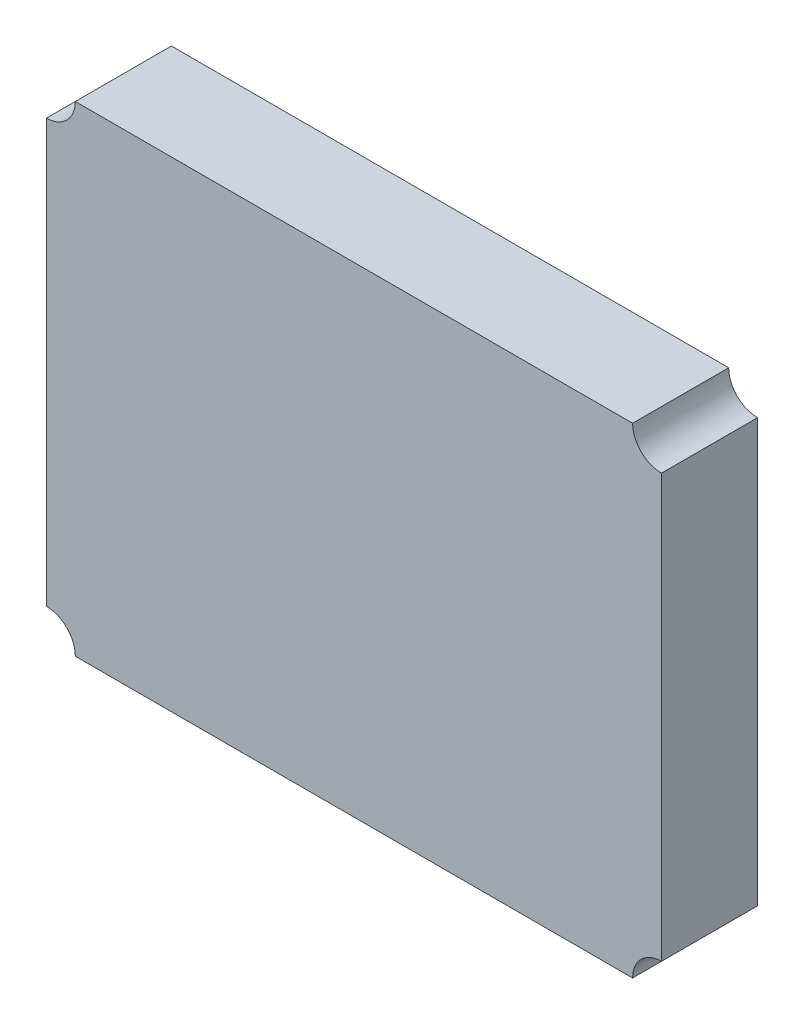
ISO-10303-21;
HEADER;
FILE_DESCRIPTION(('STEP AP214'),'2;1');
FILE_NAME('part.step','',(''),(''),'','','');
FILE_SCHEMA(('AUTOMOTIVE_DESIGN { 1 0 10303 214 1 1 1 1 }'));
ENDSEC;
DATA;
#1=APPLICATION_CONTEXT('core data for automotive mechanical design processes');
#2=APPLICATION_PROTOCOL_DEFINITION('international standard','automotive_design',2000,#1);
#3=PRODUCT_CONTEXT('',#1,'mechanical');
#4=PRODUCT('Part','Part','',(#3));
#5=PRODUCT_RELATED_PRODUCT_CATEGORY('part','',(#4));
#6=PRODUCT_DEFINITION_FORMATION('','',#4);
#7=PRODUCT_DEFINITION_CONTEXT('part definition',#1,'design');
#8=PRODUCT_DEFINITION('design','',#6,#7);
#9=PRODUCT_DEFINITION_SHAPE('','',#8);
#10=(LENGTH_UNIT() NAMED_UNIT(*) SI_UNIT(.MILLI.,.METRE.));
#11=(NAMED_UNIT(*) PLANE_ANGLE_UNIT() SI_UNIT($,.RADIAN.));
#12=(NAMED_UNIT(*) SI_UNIT($,.STERADIAN.) SOLID_ANGLE_UNIT());
#13=UNCERTAINTY_MEASURE_WITH_UNIT(LENGTH_MEASURE(1.E-05),#10,'distance_accuracy_value','');
#14=(GEOMETRIC_REPRESENTATION_CONTEXT(3) GLOBAL_UNCERTAINTY_ASSIGNED_CONTEXT((#13)) GLOBAL_UNIT_ASSIGNED_CONTEXT((#10,
#11,#12)) REPRESENTATION_CONTEXT('',''));
#15=CARTESIAN_POINT('',(0.,0.,0.));
#16=DIRECTION('',(0.,0.,1.));
#17=DIRECTION('',(1.,0.,0.));
#18=AXIS2_PLACEMENT_3D('',#15,#16,#17);
#19=CARTESIAN_POINT('',(0.,0.,0.5));
#20=DIRECTION('',(0.,0.,1.));
#21=DIRECTION('',(1.,0.,0.));
#22=AXIS2_PLACEMENT_3D('',#19,#20,#21);
#23=PLANE('',#22);
#24=CARTESIAN_POINT('',(-1.6,1.25,0.5));
#25=DIRECTION('',(0.,0.,1.));
#26=DIRECTION('',(1.,0.,0.));
#27=AXIS2_PLACEMENT_3D('',#24,#25,#26);
#28=CIRCLE('',#27,0.15);
#29=CARTESIAN_POINT('',(-1.6,1.1,0.5));
#30=VERTEX_POINT('',#29);
#31=CARTESIAN_POINT('',(-1.45,1.25,0.5));
#32=VERTEX_POINT('',#31);
#33=EDGE_CURVE('E137',#30,#32,#28,.T.);
#34=ORIENTED_EDGE('',*,*,#33,.F.);
#35=DIRECTION('',(0.,-1.,0.));
#36=VECTOR('',#35,1.);
#37=CARTESIAN_POINT('',(-1.6,1.1,0.5));
#38=LINE('',#37,#36);
#39=CARTESIAN_POINT('',(-1.6,-1.1,0.5));
#40=VERTEX_POINT('',#39);
#41=EDGE_CURVE('E144',#30,#40,#38,.T.);
#42=ORIENTED_EDGE('',*,*,#41,.T.);
#43=CARTESIAN_POINT('',(-1.6,-1.25,0.5));
#44=DIRECTION('',(0.,0.,1.));
#45=DIRECTION('',(1.,0.,0.));
#46=AXIS2_PLACEMENT_3D('',#43,#44,#45);
#47=CIRCLE('',#46,0.15);
#48=CARTESIAN_POINT('',(-1.45,-1.25,0.5));
#49=VERTEX_POINT('',#48);
#50=EDGE_CURVE('E131',#49,#40,#47,.T.);
#51=ORIENTED_EDGE('',*,*,#50,.F.);
#52=DIRECTION('',(1.,0.,0.));
#53=VECTOR('',#52,1.);
#54=CARTESIAN_POINT('',(-1.45,-1.25,0.5));
#55=LINE('',#54,#53);
#56=CARTESIAN_POINT('',(1.45,-1.25,0.5));
#57=VERTEX_POINT('',#56);
#58=EDGE_CURVE('E118',#49,#57,#55,.T.);
#59=ORIENTED_EDGE('',*,*,#58,.T.);
#60=CARTESIAN_POINT('',(1.6,-1.25,0.5));
#61=DIRECTION('',(0.,0.,1.));
#62=DIRECTION('',(1.,0.,0.));
#63=AXIS2_PLACEMENT_3D('',#60,#61,#62);
#64=CIRCLE('',#63,0.15);
#65=CARTESIAN_POINT('',(1.6,-1.1,0.5));
#66=VERTEX_POINT('',#65);
#67=EDGE_CURVE('E109',#66,#57,#64,.T.);
#68=ORIENTED_EDGE('',*,*,#67,.F.);
#69=DIRECTION('',(0.,1.,0.));
#70=VECTOR('',#69,1.);
#71=CARTESIAN_POINT('',(1.6,-1.1,0.5));
#72=LINE('',#71,#70);
#73=CARTESIAN_POINT('',(1.6,1.1,0.5));
#74=VERTEX_POINT('',#73);
#75=EDGE_CURVE('E172',#66,#74,#72,.T.);
#76=ORIENTED_EDGE('',*,*,#75,.T.);
#77=CARTESIAN_POINT('',(1.6,1.25,0.5));
#78=DIRECTION('',(0.,0.,1.));
#79=DIRECTION('',(1.,0.,0.));
#80=AXIS2_PLACEMENT_3D('',#77,#78,#79);
#81=CIRCLE('',#80,0.15);
#82=CARTESIAN_POINT('',(1.45,1.25,0.5));
#83=VERTEX_POINT('',#82);
#84=EDGE_CURVE('E177',#83,#74,#81,.T.);
#85=ORIENTED_EDGE('',*,*,#84,.F.);
#86=DIRECTION('',(1.,0.,0.));
#87=VECTOR('',#86,1.);
#88=CARTESIAN_POINT('',(-1.45,1.25,0.5));
#89=LINE('',#88,#87);
#90=EDGE_CURVE('E26',#32,#83,#89,.T.);
#91=ORIENTED_EDGE('',*,*,#90,.F.);
#92=EDGE_LOOP('',(#34,#42,#51,#59,#68,#76,#85,#91));
#93=FACE_BOUND('',#92,.T.);
#94=ADVANCED_FACE('F17',(#93),#23,.T.);
#95=CARTESIAN_POINT('',(0.,0.,0.));
#96=DIRECTION('',(0.,0.,1.));
#97=DIRECTION('',(1.,0.,0.));
#98=AXIS2_PLACEMENT_3D('',#95,#96,#97);
#99=PLANE('',#98);
#100=CARTESIAN_POINT('',(-1.6,1.25,0.));
#101=DIRECTION('',(0.,0.,1.));
#102=DIRECTION('',(1.,0.,0.));
#103=AXIS2_PLACEMENT_3D('',#100,#101,#102);
#104=CIRCLE('',#103,0.15);
#105=CARTESIAN_POINT('',(-1.6,1.1,0.));
#106=VERTEX_POINT('',#105);
#107=CARTESIAN_POINT('',(-1.45,1.25,0.));
#108=VERTEX_POINT('',#107);
#109=EDGE_CURVE('E143',#106,#108,#104,.T.);
#110=ORIENTED_EDGE('',*,*,#109,.T.);
#111=DIRECTION('',(1.,0.,0.));
#112=VECTOR('',#111,1.);
#113=CARTESIAN_POINT('',(-1.45,1.25,0.));
#114=LINE('',#113,#112);
#115=CARTESIAN_POINT('',(1.45,1.25,0.));
#116=VERTEX_POINT('',#115);
#117=EDGE_CURVE('E11',#108,#116,#114,.T.);
#118=ORIENTED_EDGE('',*,*,#117,.T.);
#119=CARTESIAN_POINT('',(1.6,1.25,0.));
#120=DIRECTION('',(0.,0.,1.));
#121=DIRECTION('',(1.,0.,0.));
#122=AXIS2_PLACEMENT_3D('',#119,#120,#121);
#123=CIRCLE('',#122,0.15);
#124=CARTESIAN_POINT('',(1.6,1.1,0.));
#125=VERTEX_POINT('',#124);
#126=EDGE_CURVE('E180',#116,#125,#123,.T.);
#127=ORIENTED_EDGE('',*,*,#126,.T.);
#128=DIRECTION('',(0.,1.,0.));
#129=VECTOR('',#128,1.);
#130=CARTESIAN_POINT('',(1.6,-1.1,0.));
#131=LINE('',#130,#129);
#132=CARTESIAN_POINT('',(1.6,-1.1,0.));
#133=VERTEX_POINT('',#132);
#134=EDGE_CURVE('E104',#133,#125,#131,.T.);
#135=ORIENTED_EDGE('',*,*,#134,.F.);
#136=CARTESIAN_POINT('',(1.6,-1.25,0.));
#137=DIRECTION('',(0.,0.,1.));
#138=DIRECTION('',(1.,0.,0.));
#139=AXIS2_PLACEMENT_3D('',#136,#137,#138);
#140=CIRCLE('',#139,0.15);
#141=CARTESIAN_POINT('',(1.45,-1.25,0.));
#142=VERTEX_POINT('',#141);
#143=EDGE_CURVE('E96',#133,#142,#140,.T.);
#144=ORIENTED_EDGE('',*,*,#143,.T.);
#145=DIRECTION('',(1.,0.,0.));
#146=VECTOR('',#145,1.);
#147=CARTESIAN_POINT('',(-1.45,-1.25,0.));
#148=LINE('',#147,#146);
#149=CARTESIAN_POINT('',(-1.45,-1.25,0.));
#150=VERTEX_POINT('',#149);
#151=EDGE_CURVE('E101',#150,#142,#148,.T.);
#152=ORIENTED_EDGE('',*,*,#151,.F.);
#153=CARTESIAN_POINT('',(-1.6,-1.25,0.));
#154=DIRECTION('',(0.,0.,1.));
#155=DIRECTION('',(1.,0.,0.));
#156=AXIS2_PLACEMENT_3D('',#153,#154,#155);
#157=CIRCLE('',#156,0.15);
#158=CARTESIAN_POINT('',(-1.6,-1.1,0.));
#159=VERTEX_POINT('',#158);
#160=EDGE_CURVE('E125',#150,#159,#157,.T.);
#161=ORIENTED_EDGE('',*,*,#160,.T.);
#162=DIRECTION('',(0.,-1.,0.));
#163=VECTOR('',#162,1.);
#164=CARTESIAN_POINT('',(-1.6,1.1,0.));
#165=LINE('',#164,#163);
#166=EDGE_CURVE('E151',#106,#159,#165,.T.);
#167=ORIENTED_EDGE('',*,*,#166,.F.);
#168=EDGE_LOOP('',(#110,#118,#127,#135,#144,#152,#161,#167));
#169=FACE_BOUND('',#168,.T.);
#170=ADVANCED_FACE('F99',(#169),#99,.F.);
#171=CARTESIAN_POINT('',(-1.45,1.25,0.));
#172=DIRECTION('',(0.,1.,0.));
#173=DIRECTION('',(1.,0.,0.));
#174=AXIS2_PLACEMENT_3D('',#171,#172,#173);
#175=PLANE('',#174);
#176=DIRECTION('',(0.,0.,1.));
#177=VECTOR('',#176,1.);
#178=CARTESIAN_POINT('',(-1.45,1.25,0.));
#179=LINE('',#178,#177);
#180=EDGE_CURVE('E140',#108,#32,#179,.T.);
#181=ORIENTED_EDGE('',*,*,#180,.T.);
#182=ORIENTED_EDGE('',*,*,#90,.T.);
#183=DIRECTION('',(0.,0.,1.));
#184=VECTOR('',#183,1.);
#185=CARTESIAN_POINT('',(1.45,1.25,0.));
#186=LINE('',#185,#184);
#187=EDGE_CURVE('E176',#116,#83,#186,.T.);
#188=ORIENTED_EDGE('',*,*,#187,.F.);
#189=ORIENTED_EDGE('',*,*,#117,.F.);
#190=EDGE_LOOP('',(#181,#182,#188,#189));
#191=FACE_BOUND('',#190,.T.);
#192=ADVANCED_FACE('F248',(#191),#175,.T.);
#193=CARTESIAN_POINT('',(1.6,1.25,0.));
#194=DIRECTION('',(0.,0.,-1.));
#195=DIRECTION('',(1.,0.,0.));
#196=AXIS2_PLACEMENT_3D('',#193,#194,#195);
#197=CYLINDRICAL_SURFACE('',#196,0.15);
#198=ORIENTED_EDGE('',*,*,#187,.T.);
#199=ORIENTED_EDGE('',*,*,#84,.T.);
#200=DIRECTION('',(0.,0.,1.));
#201=VECTOR('',#200,1.);
#202=CARTESIAN_POINT('',(1.6,1.1,0.));
#203=LINE('',#202,#201);
#204=EDGE_CURVE('E157',#125,#74,#203,.T.);
#205=ORIENTED_EDGE('',*,*,#204,.F.);
#206=ORIENTED_EDGE('',*,*,#126,.F.);
#207=EDGE_LOOP('',(#198,#199,#205,#206));
#208=FACE_BOUND('',#207,.T.);
#209=ADVANCED_FACE('F239',(#208),#197,.F.);
#210=CARTESIAN_POINT('',(1.6,-1.1,0.));
#211=DIRECTION('',(-1.,0.,0.));
#212=DIRECTION('',(0.,0.,1.));
#213=AXIS2_PLACEMENT_3D('',#210,#211,#212);
#214=PLANE('',#213);
#215=DIRECTION('',(0.,0.,1.));
#216=VECTOR('',#215,1.);
#217=CARTESIAN_POINT('',(1.6,-1.1,0.));
#218=LINE('',#217,#216);
#219=EDGE_CURVE('E154',#133,#66,#218,.T.);
#220=ORIENTED_EDGE('',*,*,#219,.F.);
#221=ORIENTED_EDGE('',*,*,#134,.T.);
#222=ORIENTED_EDGE('',*,*,#204,.T.);
#223=ORIENTED_EDGE('',*,*,#75,.F.);
#224=EDGE_LOOP('',(#220,#221,#222,#223));
#225=FACE_BOUND('',#224,.T.);
#226=ADVANCED_FACE('F225',(#225),#214,.F.);
#227=CARTESIAN_POINT('',(1.6,-1.25,0.));
#228=DIRECTION('',(0.,0.,-1.));
#229=DIRECTION('',(1.,0.,0.));
#230=AXIS2_PLACEMENT_3D('',#227,#228,#229);
#231=CYLINDRICAL_SURFACE('',#230,0.15);
#232=ORIENTED_EDGE('',*,*,#219,.T.);
#233=ORIENTED_EDGE('',*,*,#67,.T.);
#234=DIRECTION('',(0.,0.,1.));
#235=VECTOR('',#234,1.);
#236=CARTESIAN_POINT('',(1.45,-1.25,0.));
#237=LINE('',#236,#235);
#238=EDGE_CURVE('E112',#142,#57,#237,.T.);
#239=ORIENTED_EDGE('',*,*,#238,.F.);
#240=ORIENTED_EDGE('',*,*,#143,.F.);
#241=EDGE_LOOP('',(#232,#233,#239,#240));
#242=FACE_BOUND('',#241,.T.);
#243=ADVANCED_FACE('F113',(#242),#231,.F.);
#244=CARTESIAN_POINT('',(-1.45,-1.25,0.));
#245=DIRECTION('',(0.,1.,0.));
#246=DIRECTION('',(1.,0.,0.));
#247=AXIS2_PLACEMENT_3D('',#244,#245,#246);
#248=PLANE('',#247);
#249=DIRECTION('',(0.,0.,1.));
#250=VECTOR('',#249,1.);
#251=CARTESIAN_POINT('',(-1.45,-1.25,0.));
#252=LINE('',#251,#250);
#253=EDGE_CURVE('E123',#150,#49,#252,.T.);
#254=ORIENTED_EDGE('',*,*,#253,.F.);
#255=ORIENTED_EDGE('',*,*,#151,.T.);
#256=ORIENTED_EDGE('',*,*,#238,.T.);
#257=ORIENTED_EDGE('',*,*,#58,.F.);
#258=EDGE_LOOP('',(#254,#255,#256,#257));
#259=FACE_BOUND('',#258,.T.);
#260=ADVANCED_FACE('F121',(#259),#248,.F.);
#261=CARTESIAN_POINT('',(-1.6,-1.25,0.));
#262=DIRECTION('',(0.,0.,-1.));
#263=DIRECTION('',(1.,0.,0.));
#264=AXIS2_PLACEMENT_3D('',#261,#262,#263);
#265=CYLINDRICAL_SURFACE('',#264,0.15);
#266=ORIENTED_EDGE('',*,*,#253,.T.);
#267=ORIENTED_EDGE('',*,*,#50,.T.);
#268=DIRECTION('',(0.,0.,1.));
#269=VECTOR('',#268,1.);
#270=CARTESIAN_POINT('',(-1.6,-1.1,0.));
#271=LINE('',#270,#269);
#272=EDGE_CURVE('E148',#159,#40,#271,.T.);
#273=ORIENTED_EDGE('',*,*,#272,.F.);
#274=ORIENTED_EDGE('',*,*,#160,.F.);
#275=EDGE_LOOP('',(#266,#267,#273,#274));
#276=FACE_BOUND('',#275,.T.);
#277=ADVANCED_FACE('F207',(#276),#265,.F.);
#278=CARTESIAN_POINT('',(-1.6,1.1,0.));
#279=DIRECTION('',(1.,0.,0.));
#280=DIRECTION('',(0.,1.,0.));
#281=AXIS2_PLACEMENT_3D('',#278,#279,#280);
#282=PLANE('',#281);
#283=DIRECTION('',(0.,0.,1.));
#284=VECTOR('',#283,1.);
#285=CARTESIAN_POINT('',(-1.6,1.1,0.));
#286=LINE('',#285,#284);
#287=EDGE_CURVE('E135',#106,#30,#286,.T.);
#288=ORIENTED_EDGE('',*,*,#287,.F.);
#289=ORIENTED_EDGE('',*,*,#166,.T.);
#290=ORIENTED_EDGE('',*,*,#272,.T.);
#291=ORIENTED_EDGE('',*,*,#41,.F.);
#292=EDGE_LOOP('',(#288,#289,#290,#291));
#293=FACE_BOUND('',#292,.T.);
#294=ADVANCED_FACE('F197',(#293),#282,.F.);
#295=CARTESIAN_POINT('',(-1.6,1.25,0.));
#296=DIRECTION('',(0.,0.,-1.));
#297=DIRECTION('',(1.,0.,0.));
#298=AXIS2_PLACEMENT_3D('',#295,#296,#297);
#299=CYLINDRICAL_SURFACE('',#298,0.15);
#300=ORIENTED_EDGE('',*,*,#287,.T.);
#301=ORIENTED_EDGE('',*,*,#33,.T.);
#302=ORIENTED_EDGE('',*,*,#180,.F.);
#303=ORIENTED_EDGE('',*,*,#109,.F.);
#304=EDGE_LOOP('',(#300,#301,#302,#303));
#305=FACE_BOUND('',#304,.T.);
#306=ADVANCED_FACE('F192',(#305),#299,.F.);
#307=CLOSED_SHELL('',(#94,#170,#192,#209,#226,#243,#260,#277,#294,#306));
#308=MANIFOLD_SOLID_BREP('B1',#307);
#309=ADVANCED_BREP_SHAPE_REPRESENTATION('',(#18,#308),#14);
#310=SHAPE_DEFINITION_REPRESENTATION(#9,#309);
ENDSEC;
END-ISO-10303-21;
